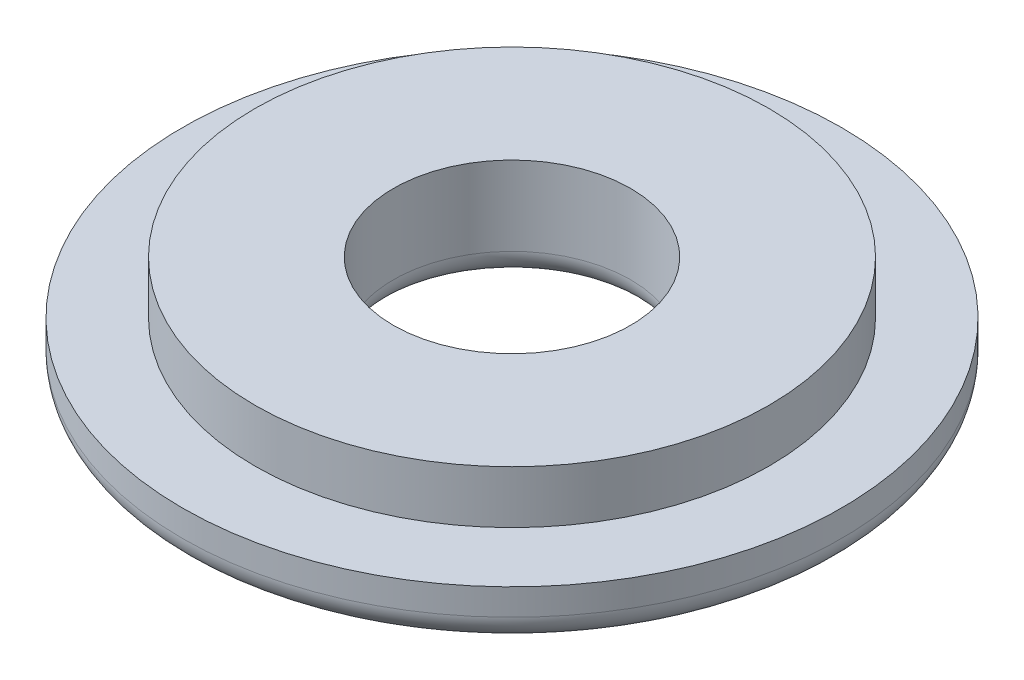
ISO-10303-21;
HEADER;
FILE_DESCRIPTION(('STEP AP214'),'2;1');
FILE_NAME('part.step','',(''),(''),'','','');
FILE_SCHEMA(('AUTOMOTIVE_DESIGN { 1 0 10303 214 1 1 1 1 }'));
ENDSEC;
DATA;
#1=APPLICATION_CONTEXT('core data for automotive mechanical design processes');
#2=APPLICATION_PROTOCOL_DEFINITION('international standard','automotive_design',2000,#1);
#3=PRODUCT_CONTEXT('',#1,'mechanical');
#4=PRODUCT('Part','Part','',(#3));
#5=PRODUCT_RELATED_PRODUCT_CATEGORY('part','',(#4));
#6=PRODUCT_DEFINITION_FORMATION('','',#4);
#7=PRODUCT_DEFINITION_CONTEXT('part definition',#1,'design');
#8=PRODUCT_DEFINITION('design','',#6,#7);
#9=PRODUCT_DEFINITION_SHAPE('','',#8);
#10=(LENGTH_UNIT() NAMED_UNIT(*) SI_UNIT(.MILLI.,.METRE.));
#11=(NAMED_UNIT(*) PLANE_ANGLE_UNIT() SI_UNIT($,.RADIAN.));
#12=(NAMED_UNIT(*) SI_UNIT($,.STERADIAN.) SOLID_ANGLE_UNIT());
#13=UNCERTAINTY_MEASURE_WITH_UNIT(LENGTH_MEASURE(1.E-05),#10,'distance_accuracy_value','');
#14=(GEOMETRIC_REPRESENTATION_CONTEXT(3) GLOBAL_UNCERTAINTY_ASSIGNED_CONTEXT((#13)) GLOBAL_UNIT_ASSIGNED_CONTEXT((#10,
#11,#12)) REPRESENTATION_CONTEXT('',''));
#15=CARTESIAN_POINT('',(0.,0.,0.));
#16=DIRECTION('',(0.,0.,1.));
#17=DIRECTION('',(1.,0.,0.));
#18=AXIS2_PLACEMENT_3D('',#15,#16,#17);
#19=CARTESIAN_POINT('',(0.,2.,0.));
#20=DIRECTION('',(0.,-1.,0.));
#21=DIRECTION('',(0.,0.,-1.));
#22=AXIS2_PLACEMENT_3D('',#19,#20,#21);
#23=CYLINDRICAL_SURFACE('',#22,12.5);
#24=CARTESIAN_POINT('',(0.,1.,0.));
#25=DIRECTION('',(0.,1.,0.));
#26=DIRECTION('',(0.,0.,1.));
#27=AXIS2_PLACEMENT_3D('',#24,#25,#26);
#28=CIRCLE('',#27,12.5);
#29=CARTESIAN_POINT('',(0.,1.,12.5));
#30=VERTEX_POINT('',#29);
#31=EDGE_CURVE('E10',#30,#30,#28,.T.);
#32=ORIENTED_EDGE('',*,*,#31,.T.);
#33=EDGE_LOOP('',(#32));
#34=FACE_BOUND('',#33,.T.);
#35=CARTESIAN_POINT('',(0.,2.,0.));
#36=DIRECTION('',(0.,1.,0.));
#37=DIRECTION('',(0.,0.,1.));
#38=AXIS2_PLACEMENT_3D('',#35,#36,#37);
#39=CIRCLE('',#38,12.5);
#40=CARTESIAN_POINT('',(0.,2.,12.5));
#41=VERTEX_POINT('',#40);
#42=EDGE_CURVE('E53',#41,#41,#39,.T.);
#43=ORIENTED_EDGE('',*,*,#42,.F.);
#44=EDGE_LOOP('',(#43));
#45=FACE_BOUND('',#44,.T.);
#46=ADVANCED_FACE('F32',(#34,#45),#23,.T.);
#47=CARTESIAN_POINT('',(0.,2.,0.));
#48=DIRECTION('',(0.,1.,0.));
#49=DIRECTION('',(0.,0.,1.));
#50=AXIS2_PLACEMENT_3D('',#47,#48,#49);
#51=PLANE('',#50);
#52=CARTESIAN_POINT('',(0.,2.,0.));
#53=DIRECTION('',(0.,1.,0.));
#54=DIRECTION('',(0.,0.,1.));
#55=AXIS2_PLACEMENT_3D('',#52,#53,#54);
#56=CIRCLE('',#55,9.75);
#57=CARTESIAN_POINT('',(0.,2.,9.75));
#58=VERTEX_POINT('',#57);
#59=EDGE_CURVE('E52',#58,#58,#56,.T.);
#60=ORIENTED_EDGE('',*,*,#59,.F.);
#61=EDGE_LOOP('',(#60));
#62=FACE_BOUND('',#61,.T.);
#63=ORIENTED_EDGE('',*,*,#42,.T.);
#64=EDGE_LOOP('',(#63));
#65=FACE_BOUND('',#64,.T.);
#66=ADVANCED_FACE('F80',(#62,#65),#51,.T.);
#67=CARTESIAN_POINT('',(0.,0.,0.));
#68=DIRECTION('',(0.,1.,0.));
#69=DIRECTION('',(0.,0.,1.));
#70=AXIS2_PLACEMENT_3D('',#67,#68,#69);
#71=PLANE('',#70);
#72=CARTESIAN_POINT('',(0.,0.,0.));
#73=DIRECTION('',(0.,1.,0.));
#74=DIRECTION('',(0.,0.,1.));
#75=AXIS2_PLACEMENT_3D('',#72,#73,#74);
#76=CIRCLE('',#75,5.5);
#77=CARTESIAN_POINT('',(0.,0.,5.5));
#78=VERTEX_POINT('',#77);
#79=EDGE_CURVE('E43',#78,#78,#76,.T.);
#80=ORIENTED_EDGE('',*,*,#79,.T.);
#81=EDGE_LOOP('',(#80));
#82=FACE_BOUND('',#81,.T.);
#83=CARTESIAN_POINT('',(0.,0.,0.));
#84=DIRECTION('',(0.,1.,0.));
#85=DIRECTION('',(0.,0.,1.));
#86=AXIS2_PLACEMENT_3D('',#83,#84,#85);
#87=CIRCLE('',#86,11.5);
#88=CARTESIAN_POINT('',(0.,0.,11.5));
#89=VERTEX_POINT('',#88);
#90=EDGE_CURVE('E47',#89,#89,#87,.F.);
#91=ORIENTED_EDGE('',*,*,#90,.T.);
#92=EDGE_LOOP('',(#91));
#93=FACE_BOUND('',#92,.T.);
#94=ADVANCED_FACE('F76',(#82,#93),#71,.F.);
#95=CARTESIAN_POINT('',(0.,4.,0.));
#96=DIRECTION('',(0.,-1.,0.));
#97=DIRECTION('',(0.,0.,-1.));
#98=AXIS2_PLACEMENT_3D('',#95,#96,#97);
#99=CYLINDRICAL_SURFACE('',#98,9.75);
#100=CARTESIAN_POINT('',(0.,4.,0.));
#101=DIRECTION('',(0.,1.,0.));
#102=DIRECTION('',(0.,0.,1.));
#103=AXIS2_PLACEMENT_3D('',#100,#101,#102);
#104=CIRCLE('',#103,9.75);
#105=CARTESIAN_POINT('',(0.,4.,9.75));
#106=VERTEX_POINT('',#105);
#107=EDGE_CURVE('E56',#106,#106,#104,.T.);
#108=ORIENTED_EDGE('',*,*,#107,.F.);
#109=EDGE_LOOP('',(#108));
#110=FACE_BOUND('',#109,.T.);
#111=ORIENTED_EDGE('',*,*,#59,.T.);
#112=EDGE_LOOP('',(#111));
#113=FACE_BOUND('',#112,.T.);
#114=ADVANCED_FACE('F70',(#110,#113),#99,.T.);
#115=CARTESIAN_POINT('',(0.,4.,0.));
#116=DIRECTION('',(0.,1.,0.));
#117=DIRECTION('',(0.,0.,1.));
#118=AXIS2_PLACEMENT_3D('',#115,#116,#117);
#119=PLANE('',#118);
#120=CARTESIAN_POINT('',(0.,4.,0.));
#121=DIRECTION('',(0.,1.,0.));
#122=DIRECTION('',(0.,0.,1.));
#123=AXIS2_PLACEMENT_3D('',#120,#121,#122);
#124=CIRCLE('',#123,4.5);
#125=CARTESIAN_POINT('',(0.,4.,4.5));
#126=VERTEX_POINT('',#125);
#127=EDGE_CURVE('E61',#126,#126,#124,.T.);
#128=ORIENTED_EDGE('',*,*,#127,.F.);
#129=EDGE_LOOP('',(#128));
#130=FACE_BOUND('',#129,.T.);
#131=ORIENTED_EDGE('',*,*,#107,.T.);
#132=EDGE_LOOP('',(#131));
#133=FACE_BOUND('',#132,.T.);
#134=ADVANCED_FACE('F67',(#130,#133),#119,.T.);
#135=CARTESIAN_POINT('',(0.,0.,0.));
#136=DIRECTION('',(0.,1.,0.));
#137=DIRECTION('',(0.,0.,1.));
#138=AXIS2_PLACEMENT_3D('',#135,#136,#137);
#139=CYLINDRICAL_SURFACE('',#138,4.5);
#140=CARTESIAN_POINT('',(0.,1.,0.));
#141=DIRECTION('',(0.,1.,0.));
#142=DIRECTION('',(0.,0.,1.));
#143=AXIS2_PLACEMENT_3D('',#140,#141,#142);
#144=CIRCLE('',#143,4.5);
#145=CARTESIAN_POINT('',(0.,1.,4.5));
#146=VERTEX_POINT('',#145);
#147=EDGE_CURVE('E39',#146,#146,#144,.F.);
#148=ORIENTED_EDGE('',*,*,#147,.T.);
#149=EDGE_LOOP('',(#148));
#150=FACE_BOUND('',#149,.T.);
#151=ORIENTED_EDGE('',*,*,#127,.T.);
#152=EDGE_LOOP('',(#151));
#153=FACE_BOUND('',#152,.T.);
#154=ADVANCED_FACE('F65',(#150,#153),#139,.F.);
#155=CARTESIAN_POINT('',(0.,1.,0.));
#156=DIRECTION('',(0.,1.,0.));
#157=DIRECTION('',(0.,0.,1.));
#158=AXIS2_PLACEMENT_3D('',#155,#156,#157);
#159=TOROIDAL_SURFACE('',#158,5.5,1.);
#160=ORIENTED_EDGE('',*,*,#147,.F.);
#161=EDGE_LOOP('',(#160));
#162=FACE_BOUND('',#161,.T.);
#163=ORIENTED_EDGE('',*,*,#79,.F.);
#164=EDGE_LOOP('',(#163));
#165=FACE_BOUND('',#164,.T.);
#166=ADVANCED_FACE('F91',(#162,#165),#159,.T.);
#167=CARTESIAN_POINT('',(0.,1.,0.));
#168=DIRECTION('',(0.,1.,0.));
#169=DIRECTION('',(0.,0.,1.));
#170=AXIS2_PLACEMENT_3D('',#167,#168,#169);
#171=TOROIDAL_SURFACE('',#170,11.5,1.);
#172=ORIENTED_EDGE('',*,*,#90,.F.);
#173=EDGE_LOOP('',(#172));
#174=FACE_BOUND('',#173,.T.);
#175=ORIENTED_EDGE('',*,*,#31,.F.);
#176=EDGE_LOOP('',(#175));
#177=FACE_BOUND('',#176,.T.);
#178=ADVANCED_FACE('F34',(#174,#177),#171,.T.);
#179=CLOSED_SHELL('',(#46,#66,#94,#114,#134,#154,#166,#178));
#180=MANIFOLD_SOLID_BREP('B2',#179);
#181=ADVANCED_BREP_SHAPE_REPRESENTATION('',(#18,#180),#14);
#182=SHAPE_DEFINITION_REPRESENTATION(#9,#181);
ENDSEC;
END-ISO-10303-21;
